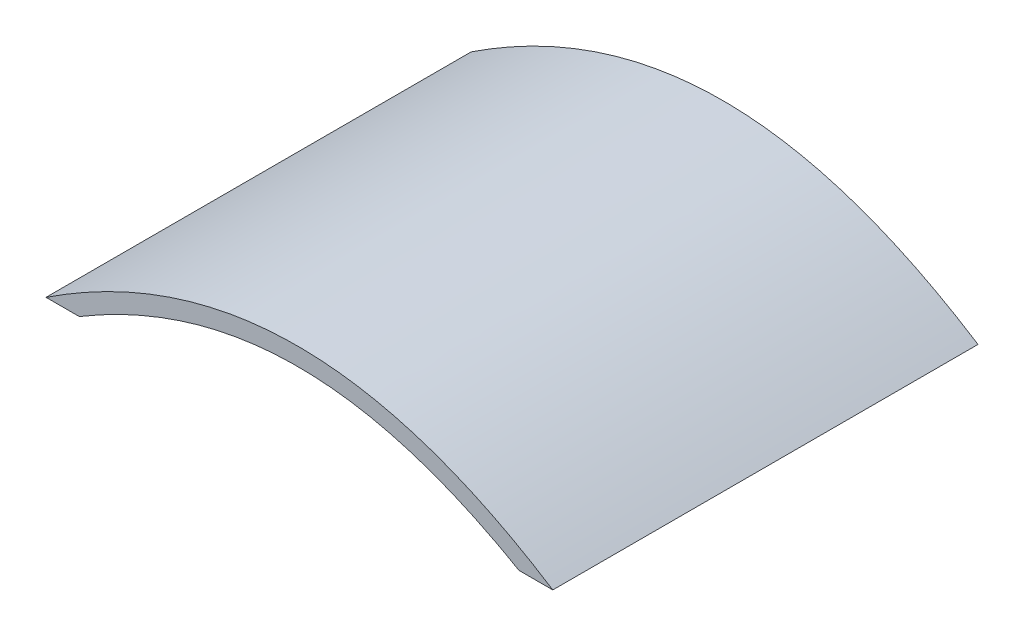
ISO-10303-21;
HEADER;
FILE_DESCRIPTION(('STEP AP214'),'2;1');
FILE_NAME('part.step','',(''),(''),'','','');
FILE_SCHEMA(('AUTOMOTIVE_DESIGN { 1 0 10303 214 1 1 1 1 }'));
ENDSEC;
DATA;
#1=APPLICATION_CONTEXT('core data for automotive mechanical design processes');
#2=APPLICATION_PROTOCOL_DEFINITION('international standard','automotive_design',2000,#1);
#3=PRODUCT_CONTEXT('',#1,'mechanical');
#4=PRODUCT('Part','Part','',(#3));
#5=PRODUCT_RELATED_PRODUCT_CATEGORY('part','',(#4));
#6=PRODUCT_DEFINITION_FORMATION('','',#4);
#7=PRODUCT_DEFINITION_CONTEXT('part definition',#1,'design');
#8=PRODUCT_DEFINITION('design','',#6,#7);
#9=PRODUCT_DEFINITION_SHAPE('','',#8);
#10=(LENGTH_UNIT() NAMED_UNIT(*) SI_UNIT(.MILLI.,.METRE.));
#11=(NAMED_UNIT(*) PLANE_ANGLE_UNIT() SI_UNIT($,.RADIAN.));
#12=(NAMED_UNIT(*) SI_UNIT($,.STERADIAN.) SOLID_ANGLE_UNIT());
#13=UNCERTAINTY_MEASURE_WITH_UNIT(LENGTH_MEASURE(1.E-05),#10,'distance_accuracy_value','');
#14=(GEOMETRIC_REPRESENTATION_CONTEXT(3) GLOBAL_UNCERTAINTY_ASSIGNED_CONTEXT((#13)) GLOBAL_UNIT_ASSIGNED_CONTEXT((#10,
#11,#12)) REPRESENTATION_CONTEXT('',''));
#15=CARTESIAN_POINT('',(0.,0.,0.));
#16=DIRECTION('',(0.,0.,1.));
#17=DIRECTION('',(1.,0.,0.));
#18=AXIS2_PLACEMENT_3D('',#15,#16,#17);
#19=CARTESIAN_POINT('',(42.9069642476376,0.,72.));
#20=CARTESIAN_POINT('',(19.9885809193862,14.6901724070038,72.));
#21=CARTESIAN_POINT('',(0.,17.9262878417477,72.));
#22=CARTESIAN_POINT('',(-20.0482322030446,15.0830158163089,72.));
#23=CARTESIAN_POINT('',(-42.9069642476376,0.,72.));
#24=B_SPLINE_CURVE_WITH_KNOTS('',4,(#19,#20,#21,#22,#23),.UNSPECIFIED.,.F.,.F.,(5,5),(0.,1.),.UNSPECIFIED.);
#25=DIRECTION('',(0.,0.,-1.));
#26=VECTOR('',#25,1.);
#27=SURFACE_OF_LINEAR_EXTRUSION('',#24,#26);
#28=CARTESIAN_POINT('',(42.9069642476376,0.,0.));
#29=CARTESIAN_POINT('',(19.9885809193862,14.6901724070038,0.));
#30=CARTESIAN_POINT('',(0.,17.9262878417477,0.));
#31=CARTESIAN_POINT('',(-20.0482322030446,15.0830158163089,0.));
#32=CARTESIAN_POINT('',(-42.9069642476376,0.,0.));
#33=B_SPLINE_CURVE_WITH_KNOTS('',4,(#28,#29,#30,#31,#32),.UNSPECIFIED.,.F.,.F.,(5,5),(0.,1.),.UNSPECIFIED.);
#34=CARTESIAN_POINT('',(42.9069642476376,0.,0.));
#35=VERTEX_POINT('',#34);
#36=CARTESIAN_POINT('',(-42.9069642476376,0.,0.));
#37=VERTEX_POINT('',#36);
#38=EDGE_CURVE('E117',#35,#37,#33,.T.);
#39=ORIENTED_EDGE('',*,*,#38,.T.);
#40=DIRECTION('',(0.,0.,-1.));
#41=VECTOR('',#40,1.);
#42=CARTESIAN_POINT('',(-42.9069642476376,0.,72.));
#43=LINE('',#42,#41);
#44=CARTESIAN_POINT('',(-42.9069642476376,0.,72.));
#45=VERTEX_POINT('',#44);
#46=EDGE_CURVE('E11',#45,#37,#43,.T.);
#47=ORIENTED_EDGE('',*,*,#46,.F.);
#48=CARTESIAN_POINT('',(42.9069642476376,0.,72.));
#49=VERTEX_POINT('',#48);
#50=EDGE_CURVE('E86',#49,#45,#24,.T.);
#51=ORIENTED_EDGE('',*,*,#50,.F.);
#52=DIRECTION('',(0.,0.,-1.));
#53=VECTOR('',#52,1.);
#54=CARTESIAN_POINT('',(42.9069642476376,0.,72.));
#55=LINE('',#54,#53);
#56=EDGE_CURVE('E94',#49,#35,#55,.T.);
#57=ORIENTED_EDGE('',*,*,#56,.T.);
#58=EDGE_LOOP('',(#39,#47,#51,#57));
#59=FACE_BOUND('',#58,.T.);
#60=ADVANCED_FACE('F34',(#59),#27,.F.);
#61=CARTESIAN_POINT('',(-42.9069642476376,0.,72.));
#62=DIRECTION('',(0.,1.,0.));
#63=DIRECTION('',(-1.,0.,0.));
#64=AXIS2_PLACEMENT_3D('',#61,#62,#63);
#65=PLANE('',#64);
#66=DIRECTION('',(1.,0.,0.));
#67=VECTOR('',#66,1.);
#68=CARTESIAN_POINT('',(-42.9069642476376,0.,0.));
#69=LINE('',#68,#67);
#70=CARTESIAN_POINT('',(-37.2752786090421,0.,0.));
#71=VERTEX_POINT('',#70);
#72=EDGE_CURVE('E90',#37,#71,#69,.T.);
#73=ORIENTED_EDGE('',*,*,#72,.T.);
#74=DIRECTION('',(0.,0.,-1.));
#75=VECTOR('',#74,1.);
#76=CARTESIAN_POINT('',(-37.2752786090421,0.,72.));
#77=LINE('',#76,#75);
#78=CARTESIAN_POINT('',(-37.2752786090421,0.,72.));
#79=VERTEX_POINT('',#78);
#80=EDGE_CURVE('E43',#79,#71,#77,.T.);
#81=ORIENTED_EDGE('',*,*,#80,.F.);
#82=DIRECTION('',(1.,0.,0.));
#83=VECTOR('',#82,1.);
#84=CARTESIAN_POINT('',(-42.9069642476376,0.,72.));
#85=LINE('',#84,#83);
#86=EDGE_CURVE('E81',#45,#79,#85,.T.);
#87=ORIENTED_EDGE('',*,*,#86,.F.);
#88=ORIENTED_EDGE('',*,*,#46,.T.);
#89=EDGE_LOOP('',(#73,#81,#87,#88));
#90=FACE_BOUND('',#89,.T.);
#91=ADVANCED_FACE('F89',(#90),#65,.F.);
#92=CARTESIAN_POINT('',(-41.2546595047828,-2.50411058917937,72.));
#93=CARTESIAN_POINT('',(-40.3419447435503,-1.90186829925164,72.));
#94=CARTESIAN_POINT('',(-38.4772165809066,-0.710956517756417,72.));
#95=CARTESIAN_POINT('',(-34.848749545784,1.45072261197947,72.));
#96=CARTESIAN_POINT('',(-30.3775542524904,3.83047324249432,72.));
#97=CARTESIAN_POINT('',(-25.13655151253,6.17833722208334,72.));
#98=CARTESIAN_POINT('',(-18.2780315219549,8.6783348802037,72.));
#99=CARTESIAN_POINT('',(-9.90868333730894,10.6807438844076,72.));
#100=CARTESIAN_POINT('',(-0.030251800973985,11.4314064799763,72.));
#101=CARTESIAN_POINT('',(9.85497460078784,10.5871130553463,72.));
#102=CARTESIAN_POINT('',(18.2397867732544,8.53235222217692,72.));
#103=CARTESIAN_POINT('',(25.1152673286756,6.02341465949447,72.));
#104=CARTESIAN_POINT('',(30.3714112104305,3.6900300821133,72.));
#105=CARTESIAN_POINT('',(34.8571729021786,1.34445943295023,72.));
#106=CARTESIAN_POINT('',(38.499550854265,-0.774927372428,72.));
#107=CARTESIAN_POINT('',(40.3708165015744,-1.9378841429447,72.));
#108=CARTESIAN_POINT('',(41.2879953954723,-2.52577518101984,72.));
#109=B_SPLINE_CURVE_WITH_KNOTS('',3,(#92,#93,#94,#95,#96,#97,#98,#99,#100,#101,#102,#103,#104,
#105,#106,#107,#108),.UNSPECIFIED.,.F.,.F.,(4,1,1,1,1,1,1,1,1,1,1,1,1,1,4),(0.,0.03125,0.0625,
0.125,0.1875,0.25,0.375,0.5,0.625,0.75,0.8125,0.875,0.9375,0.96875,1.),.UNSPECIFIED.);
#110=DIRECTION('',(0.,0.,-1.));
#111=VECTOR('',#110,1.);
#112=SURFACE_OF_LINEAR_EXTRUSION('',#109,#111);
#113=CARTESIAN_POINT('',(-41.2546595047828,-2.50411058917937,0.));
#114=CARTESIAN_POINT('',(-40.3419447435503,-1.90186829925164,0.));
#115=CARTESIAN_POINT('',(-38.4772165809066,-0.710956517756417,0.));
#116=CARTESIAN_POINT('',(-34.848749545784,1.45072261197947,0.));
#117=CARTESIAN_POINT('',(-30.3775542524904,3.83047324249432,0.));
#118=CARTESIAN_POINT('',(-25.13655151253,6.17833722208334,0.));
#119=CARTESIAN_POINT('',(-18.2780315219549,8.6783348802037,0.));
#120=CARTESIAN_POINT('',(-9.90868333730894,10.6807438844076,0.));
#121=CARTESIAN_POINT('',(-0.030251800973985,11.4314064799763,0.));
#122=CARTESIAN_POINT('',(9.85497460078784,10.5871130553463,0.));
#123=CARTESIAN_POINT('',(18.2397867732544,8.53235222217692,0.));
#124=CARTESIAN_POINT('',(25.1152673286756,6.02341465949447,0.));
#125=CARTESIAN_POINT('',(30.3714112104305,3.6900300821133,0.));
#126=CARTESIAN_POINT('',(34.8571729021786,1.34445943295023,0.));
#127=CARTESIAN_POINT('',(38.499550854265,-0.774927372428,0.));
#128=CARTESIAN_POINT('',(40.3708165015744,-1.9378841429447,0.));
#129=CARTESIAN_POINT('',(41.2879953954723,-2.52577518101984,0.));
#130=B_SPLINE_CURVE_WITH_KNOTS('',3,(#113,#114,#115,#116,#117,#118,#119,#120,#121,#122,#123,
#124,#125,#126,#127,#128,#129),.UNSPECIFIED.,.F.,.F.,(4,1,1,1,1,1,1,1,1,1,1,1,1,1,4),(0.,
0.03125,0.0625,0.125,0.1875,0.25,0.375,0.5,0.625,0.75,0.8125,0.875,0.9375,0.96875,1.),.UNSPECIFIED.);
#131=CARTESIAN_POINT('',(37.1599734268638,0.,0.));
#132=VERTEX_POINT('',#131);
#133=EDGE_CURVE('E68',#71,#132,#130,.T.);
#134=ORIENTED_EDGE('',*,*,#133,.T.);
#135=DIRECTION('',(0.,0.,-1.));
#136=VECTOR('',#135,1.);
#137=CARTESIAN_POINT('',(37.1599734268638,0.,72.));
#138=LINE('',#137,#136);
#139=CARTESIAN_POINT('',(37.1599734268638,0.,72.));
#140=VERTEX_POINT('',#139);
#141=EDGE_CURVE('E91',#140,#132,#138,.T.);
#142=ORIENTED_EDGE('',*,*,#141,.F.);
#143=EDGE_CURVE('E84',#79,#140,#109,.T.);
#144=ORIENTED_EDGE('',*,*,#143,.F.);
#145=ORIENTED_EDGE('',*,*,#80,.T.);
#146=EDGE_LOOP('',(#134,#142,#144,#145));
#147=FACE_BOUND('',#146,.T.);
#148=ADVANCED_FACE('F92',(#147),#112,.F.);
#149=CARTESIAN_POINT('',(42.9069642476376,0.,72.));
#150=DIRECTION('',(0.,1.,0.));
#151=DIRECTION('',(-1.,0.,0.));
#152=AXIS2_PLACEMENT_3D('',#149,#150,#151);
#153=PLANE('',#152);
#154=DIRECTION('',(1.,0.,0.));
#155=VECTOR('',#154,1.);
#156=CARTESIAN_POINT('',(42.9069642476376,0.,0.));
#157=LINE('',#156,#155);
#158=EDGE_CURVE('E74',#132,#35,#157,.T.);
#159=ORIENTED_EDGE('',*,*,#158,.T.);
#160=ORIENTED_EDGE('',*,*,#56,.F.);
#161=DIRECTION('',(1.,0.,0.));
#162=VECTOR('',#161,1.);
#163=CARTESIAN_POINT('',(42.9069642476376,0.,72.));
#164=LINE('',#163,#162);
#165=EDGE_CURVE('E51',#140,#49,#164,.T.);
#166=ORIENTED_EDGE('',*,*,#165,.F.);
#167=ORIENTED_EDGE('',*,*,#141,.T.);
#168=EDGE_LOOP('',(#159,#160,#166,#167));
#169=FACE_BOUND('',#168,.T.);
#170=ADVANCED_FACE('F106',(#169),#153,.F.);
#171=CARTESIAN_POINT('',(-0.0149128209146025,14.1656549964836,72.));
#172=DIRECTION('',(0.,0.,1.));
#173=DIRECTION('',(1.,0.,0.));
#174=AXIS2_PLACEMENT_3D('',#171,#172,#173);
#175=PLANE('',#174);
#176=ORIENTED_EDGE('',*,*,#50,.T.);
#177=ORIENTED_EDGE('',*,*,#86,.T.);
#178=ORIENTED_EDGE('',*,*,#143,.T.);
#179=ORIENTED_EDGE('',*,*,#165,.T.);
#180=EDGE_LOOP('',(#176,#177,#178,#179));
#181=FACE_BOUND('',#180,.T.);
#182=ADVANCED_FACE('F82',(#181),#175,.T.);
#183=CARTESIAN_POINT('',(-0.0149128209146025,14.1656549964836,0.));
#184=DIRECTION('',(0.,0.,1.));
#185=DIRECTION('',(1.,0.,0.));
#186=AXIS2_PLACEMENT_3D('',#183,#184,#185);
#187=PLANE('',#186);
#188=ORIENTED_EDGE('',*,*,#38,.F.);
#189=ORIENTED_EDGE('',*,*,#158,.F.);
#190=ORIENTED_EDGE('',*,*,#133,.F.);
#191=ORIENTED_EDGE('',*,*,#72,.F.);
#192=EDGE_LOOP('',(#188,#189,#190,#191));
#193=FACE_BOUND('',#192,.T.);
#194=ADVANCED_FACE('F134',(#193),#187,.F.);
#195=CLOSED_SHELL('',(#60,#91,#148,#170,#182,#194));
#196=MANIFOLD_SOLID_BREP('B2',#195);
#197=ADVANCED_BREP_SHAPE_REPRESENTATION('',(#18,#196),#14);
#198=SHAPE_DEFINITION_REPRESENTATION(#9,#197);
ENDSEC;
END-ISO-10303-21;
